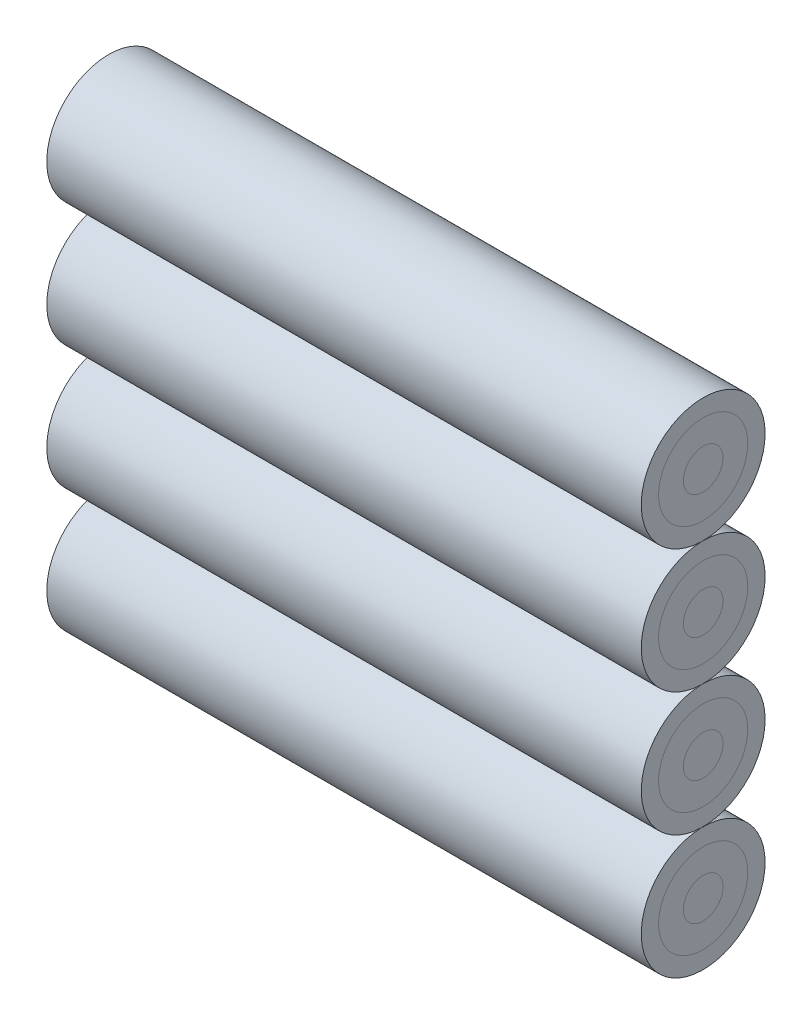
ISO-10303-21;
HEADER;
FILE_DESCRIPTION(('STEP AP214'),'2;1');
FILE_NAME('part.step','',(''),(''),'','','');
FILE_SCHEMA(('AUTOMOTIVE_DESIGN { 1 0 10303 214 1 1 1 1 }'));
ENDSEC;
DATA;
#1=APPLICATION_CONTEXT('core data for automotive mechanical design processes');
#2=APPLICATION_PROTOCOL_DEFINITION('international standard','automotive_design',2000,#1);
#3=PRODUCT_CONTEXT('',#1,'mechanical');
#4=PRODUCT('Part','Part','',(#3));
#5=PRODUCT_RELATED_PRODUCT_CATEGORY('part','',(#4));
#6=PRODUCT_DEFINITION_FORMATION('','',#4);
#7=PRODUCT_DEFINITION_CONTEXT('part definition',#1,'design');
#8=PRODUCT_DEFINITION('design','',#6,#7);
#9=PRODUCT_DEFINITION_SHAPE('','',#8);
#10=(LENGTH_UNIT() NAMED_UNIT(*) SI_UNIT(.MILLI.,.METRE.));
#11=(NAMED_UNIT(*) PLANE_ANGLE_UNIT() SI_UNIT($,.RADIAN.));
#12=(NAMED_UNIT(*) SI_UNIT($,.STERADIAN.) SOLID_ANGLE_UNIT());
#13=UNCERTAINTY_MEASURE_WITH_UNIT(LENGTH_MEASURE(1.E-05),#10,'distance_accuracy_value','');
#14=(GEOMETRIC_REPRESENTATION_CONTEXT(3) GLOBAL_UNCERTAINTY_ASSIGNED_CONTEXT((#13)) GLOBAL_UNIT_ASSIGNED_CONTEXT((#10,
#11,#12)) REPRESENTATION_CONTEXT('',''));
#15=CARTESIAN_POINT('',(0.,0.,0.));
#16=DIRECTION('',(0.,0.,1.));
#17=DIRECTION('',(1.,0.,0.));
#18=AXIS2_PLACEMENT_3D('',#15,#16,#17);
#19=CARTESIAN_POINT('',(1200.,-375.,0.));
#20=DIRECTION('',(-1.,0.,0.));
#21=DIRECTION('',(0.,0.,1.));
#22=AXIS2_PLACEMENT_3D('',#19,#20,#21);
#23=CYLINDRICAL_SURFACE('',#22,40.);
#24=CARTESIAN_POINT('',(1200.,-375.,0.));
#25=DIRECTION('',(1.,0.,0.));
#26=DIRECTION('',(0.,0.,-1.));
#27=AXIS2_PLACEMENT_3D('',#24,#25,#26);
#28=CIRCLE('',#27,40.);
#29=CARTESIAN_POINT('',(1200.,-375.,-40.));
#30=VERTEX_POINT('',#29);
#31=EDGE_CURVE('E12',#30,#30,#28,.T.);
#32=ORIENTED_EDGE('',*,*,#31,.F.);
#33=EDGE_LOOP('',(#32));
#34=FACE_BOUND('',#33,.T.);
#35=CARTESIAN_POINT('',(0.,-375.,0.));
#36=DIRECTION('',(1.,0.,0.));
#37=DIRECTION('',(0.,0.,-1.));
#38=AXIS2_PLACEMENT_3D('',#35,#36,#37);
#39=CIRCLE('',#38,40.);
#40=CARTESIAN_POINT('',(0.,-375.,-40.));
#41=VERTEX_POINT('',#40);
#42=EDGE_CURVE('E66',#41,#41,#39,.T.);
#43=ORIENTED_EDGE('',*,*,#42,.T.);
#44=EDGE_LOOP('',(#43));
#45=FACE_BOUND('',#44,.T.);
#46=ADVANCED_FACE('F63',(#34,#45),#23,.T.);
#47=CARTESIAN_POINT('',(1200.,-375.,0.));
#48=DIRECTION('',(1.,0.,0.));
#49=DIRECTION('',(0.,0.,-1.));
#50=AXIS2_PLACEMENT_3D('',#47,#48,#49);
#51=PLANE('',#50);
#52=ORIENTED_EDGE('',*,*,#31,.T.);
#53=EDGE_LOOP('',(#52));
#54=FACE_BOUND('',#53,.T.);
#55=ADVANCED_FACE('F78',(#54),#51,.T.);
#56=CARTESIAN_POINT('',(0.,-375.,0.));
#57=DIRECTION('',(1.,0.,0.));
#58=DIRECTION('',(0.,0.,-1.));
#59=AXIS2_PLACEMENT_3D('',#56,#57,#58);
#60=PLANE('',#59);
#61=ORIENTED_EDGE('',*,*,#42,.F.);
#62=EDGE_LOOP('',(#61));
#63=FACE_BOUND('',#62,.T.);
#64=ADVANCED_FACE('F76',(#63),#60,.F.);
#65=CLOSED_SHELL('',(#46,#55,#64));
#66=MANIFOLD_SOLID_BREP('B2',#65);
#67=CARTESIAN_POINT('',(1200.,-125.,0.));
#68=DIRECTION('',(-1.,0.,0.));
#69=DIRECTION('',(0.,0.,1.));
#70=AXIS2_PLACEMENT_3D('',#67,#68,#69);
#71=CYLINDRICAL_SURFACE('',#70,40.);
#72=CARTESIAN_POINT('',(1200.,-125.,0.));
#73=DIRECTION('',(1.,0.,0.));
#74=DIRECTION('',(0.,0.,-1.));
#75=AXIS2_PLACEMENT_3D('',#72,#73,#74);
#76=CIRCLE('',#75,40.);
#77=CARTESIAN_POINT('',(1200.,-125.,-40.));
#78=VERTEX_POINT('',#77);
#79=EDGE_CURVE('E62',#78,#78,#76,.T.);
#80=ORIENTED_EDGE('',*,*,#79,.F.);
#81=EDGE_LOOP('',(#80));
#82=FACE_BOUND('',#81,.T.);
#83=CARTESIAN_POINT('',(0.,-125.,0.));
#84=DIRECTION('',(1.,0.,0.));
#85=DIRECTION('',(0.,0.,-1.));
#86=AXIS2_PLACEMENT_3D('',#83,#84,#85);
#87=CIRCLE('',#86,40.);
#88=CARTESIAN_POINT('',(0.,-125.,-40.));
#89=VERTEX_POINT('',#88);
#90=EDGE_CURVE('E114',#89,#89,#87,.T.);
#91=ORIENTED_EDGE('',*,*,#90,.T.);
#92=EDGE_LOOP('',(#91));
#93=FACE_BOUND('',#92,.T.);
#94=ADVANCED_FACE('F111',(#82,#93),#71,.T.);
#95=CARTESIAN_POINT('',(1200.,-125.,0.));
#96=DIRECTION('',(1.,0.,0.));
#97=DIRECTION('',(0.,0.,-1.));
#98=AXIS2_PLACEMENT_3D('',#95,#96,#97);
#99=PLANE('',#98);
#100=ORIENTED_EDGE('',*,*,#79,.T.);
#101=EDGE_LOOP('',(#100));
#102=FACE_BOUND('',#101,.T.);
#103=ADVANCED_FACE('F126',(#102),#99,.T.);
#104=CARTESIAN_POINT('',(0.,-125.,0.));
#105=DIRECTION('',(1.,0.,0.));
#106=DIRECTION('',(0.,0.,-1.));
#107=AXIS2_PLACEMENT_3D('',#104,#105,#106);
#108=PLANE('',#107);
#109=ORIENTED_EDGE('',*,*,#90,.F.);
#110=EDGE_LOOP('',(#109));
#111=FACE_BOUND('',#110,.T.);
#112=ADVANCED_FACE('F124',(#111),#108,.F.);
#113=CLOSED_SHELL('',(#94,#103,#112));
#114=MANIFOLD_SOLID_BREP('B7',#113);
#115=CARTESIAN_POINT('',(1200.,125.,0.));
#116=DIRECTION('',(-1.,0.,0.));
#117=DIRECTION('',(0.,0.,1.));
#118=AXIS2_PLACEMENT_3D('',#115,#116,#117);
#119=CYLINDRICAL_SURFACE('',#118,40.);
#120=CARTESIAN_POINT('',(1200.,125.,0.));
#121=DIRECTION('',(1.,0.,0.));
#122=DIRECTION('',(0.,0.,-1.));
#123=AXIS2_PLACEMENT_3D('',#120,#121,#122);
#124=CIRCLE('',#123,40.);
#125=CARTESIAN_POINT('',(1200.,125.,-40.));
#126=VERTEX_POINT('',#125);
#127=EDGE_CURVE('E110',#126,#126,#124,.T.);
#128=ORIENTED_EDGE('',*,*,#127,.F.);
#129=EDGE_LOOP('',(#128));
#130=FACE_BOUND('',#129,.T.);
#131=CARTESIAN_POINT('',(0.,125.,0.));
#132=DIRECTION('',(1.,0.,0.));
#133=DIRECTION('',(0.,0.,-1.));
#134=AXIS2_PLACEMENT_3D('',#131,#132,#133);
#135=CIRCLE('',#134,40.);
#136=CARTESIAN_POINT('',(0.,125.,-40.));
#137=VERTEX_POINT('',#136);
#138=EDGE_CURVE('E162',#137,#137,#135,.T.);
#139=ORIENTED_EDGE('',*,*,#138,.T.);
#140=EDGE_LOOP('',(#139));
#141=FACE_BOUND('',#140,.T.);
#142=ADVANCED_FACE('F159',(#130,#141),#119,.T.);
#143=CARTESIAN_POINT('',(1200.,125.,0.));
#144=DIRECTION('',(1.,0.,0.));
#145=DIRECTION('',(0.,0.,-1.));
#146=AXIS2_PLACEMENT_3D('',#143,#144,#145);
#147=PLANE('',#146);
#148=ORIENTED_EDGE('',*,*,#127,.T.);
#149=EDGE_LOOP('',(#148));
#150=FACE_BOUND('',#149,.T.);
#151=ADVANCED_FACE('F174',(#150),#147,.T.);
#152=CARTESIAN_POINT('',(0.,125.,0.));
#153=DIRECTION('',(1.,0.,0.));
#154=DIRECTION('',(0.,0.,-1.));
#155=AXIS2_PLACEMENT_3D('',#152,#153,#154);
#156=PLANE('',#155);
#157=ORIENTED_EDGE('',*,*,#138,.F.);
#158=EDGE_LOOP('',(#157));
#159=FACE_BOUND('',#158,.T.);
#160=ADVANCED_FACE('F172',(#159),#156,.F.);
#161=CLOSED_SHELL('',(#142,#151,#160));
#162=MANIFOLD_SOLID_BREP('B57',#161);
#163=CARTESIAN_POINT('',(1200.,375.,0.));
#164=DIRECTION('',(-1.,0.,0.));
#165=DIRECTION('',(0.,0.,1.));
#166=AXIS2_PLACEMENT_3D('',#163,#164,#165);
#167=CYLINDRICAL_SURFACE('',#166,40.);
#168=CARTESIAN_POINT('',(1200.,375.,0.));
#169=DIRECTION('',(1.,0.,0.));
#170=DIRECTION('',(0.,0.,-1.));
#171=AXIS2_PLACEMENT_3D('',#168,#169,#170);
#172=CIRCLE('',#171,40.);
#173=CARTESIAN_POINT('',(1200.,375.,-40.));
#174=VERTEX_POINT('',#173);
#175=EDGE_CURVE('E158',#174,#174,#172,.T.);
#176=ORIENTED_EDGE('',*,*,#175,.F.);
#177=EDGE_LOOP('',(#176));
#178=FACE_BOUND('',#177,.T.);
#179=CARTESIAN_POINT('',(0.,375.,0.));
#180=DIRECTION('',(1.,0.,0.));
#181=DIRECTION('',(0.,0.,-1.));
#182=AXIS2_PLACEMENT_3D('',#179,#180,#181);
#183=CIRCLE('',#182,40.);
#184=CARTESIAN_POINT('',(0.,375.,-40.));
#185=VERTEX_POINT('',#184);
#186=EDGE_CURVE('E210',#185,#185,#183,.T.);
#187=ORIENTED_EDGE('',*,*,#186,.T.);
#188=EDGE_LOOP('',(#187));
#189=FACE_BOUND('',#188,.T.);
#190=ADVANCED_FACE('F207',(#178,#189),#167,.T.);
#191=CARTESIAN_POINT('',(1200.,375.,0.));
#192=DIRECTION('',(1.,0.,0.));
#193=DIRECTION('',(0.,0.,-1.));
#194=AXIS2_PLACEMENT_3D('',#191,#192,#193);
#195=PLANE('',#194);
#196=ORIENTED_EDGE('',*,*,#175,.T.);
#197=EDGE_LOOP('',(#196));
#198=FACE_BOUND('',#197,.T.);
#199=ADVANCED_FACE('F222',(#198),#195,.T.);
#200=CARTESIAN_POINT('',(0.,375.,0.));
#201=DIRECTION('',(1.,0.,0.));
#202=DIRECTION('',(0.,0.,-1.));
#203=AXIS2_PLACEMENT_3D('',#200,#201,#202);
#204=PLANE('',#203);
#205=ORIENTED_EDGE('',*,*,#186,.F.);
#206=EDGE_LOOP('',(#205));
#207=FACE_BOUND('',#206,.T.);
#208=ADVANCED_FACE('F220',(#207),#204,.F.);
#209=CLOSED_SHELL('',(#190,#199,#208));
#210=MANIFOLD_SOLID_BREP('B105',#209);
#211=CARTESIAN_POINT('',(1200.,-375.,0.));
#212=DIRECTION('',(-1.,0.,0.));
#213=DIRECTION('',(0.,0.,1.));
#214=AXIS2_PLACEMENT_3D('',#211,#212,#213);
#215=CYLINDRICAL_SURFACE('',#214,90.);
#216=CARTESIAN_POINT('',(1200.,-375.,0.));
#217=DIRECTION('',(1.,0.,0.));
#218=DIRECTION('',(0.,0.,-1.));
#219=AXIS2_PLACEMENT_3D('',#216,#217,#218);
#220=CIRCLE('',#219,90.);
#221=CARTESIAN_POINT('',(1200.,-375.,-90.));
#222=VERTEX_POINT('',#221);
#223=EDGE_CURVE('E206',#222,#222,#220,.T.);
#224=ORIENTED_EDGE('',*,*,#223,.F.);
#225=EDGE_LOOP('',(#224));
#226=FACE_BOUND('',#225,.T.);
#227=CARTESIAN_POINT('',(0.,-375.,0.));
#228=DIRECTION('',(1.,0.,0.));
#229=DIRECTION('',(0.,0.,-1.));
#230=AXIS2_PLACEMENT_3D('',#227,#228,#229);
#231=CIRCLE('',#230,90.);
#232=CARTESIAN_POINT('',(0.,-375.,-90.));
#233=VERTEX_POINT('',#232);
#234=EDGE_CURVE('E258',#233,#233,#231,.T.);
#235=ORIENTED_EDGE('',*,*,#234,.T.);
#236=EDGE_LOOP('',(#235));
#237=FACE_BOUND('',#236,.T.);
#238=ADVANCED_FACE('F255',(#226,#237),#215,.T.);
#239=CARTESIAN_POINT('',(1200.,-375.,0.));
#240=DIRECTION('',(1.,0.,0.));
#241=DIRECTION('',(0.,0.,-1.));
#242=AXIS2_PLACEMENT_3D('',#239,#240,#241);
#243=PLANE('',#242);
#244=CARTESIAN_POINT('',(1200.,-375.,0.));
#245=DIRECTION('',(1.,0.,0.));
#246=DIRECTION('',(0.,0.,-1.));
#247=AXIS2_PLACEMENT_3D('',#244,#245,#246);
#248=CIRCLE('',#247,40.);
#249=CARTESIAN_POINT('',(1200.,-375.,-40.));
#250=VERTEX_POINT('',#249);
#251=EDGE_CURVE('E267',#250,#250,#248,.T.);
#252=ORIENTED_EDGE('',*,*,#251,.F.);
#253=EDGE_LOOP('',(#252));
#254=FACE_BOUND('',#253,.T.);
#255=ORIENTED_EDGE('',*,*,#223,.T.);
#256=EDGE_LOOP('',(#255));
#257=FACE_BOUND('',#256,.T.);
#258=ADVANCED_FACE('F282',(#254,#257),#243,.T.);
#259=CARTESIAN_POINT('',(0.,-375.,0.));
#260=DIRECTION('',(1.,0.,0.));
#261=DIRECTION('',(0.,0.,-1.));
#262=AXIS2_PLACEMENT_3D('',#259,#260,#261);
#263=PLANE('',#262);
#264=CARTESIAN_POINT('',(0.,-375.,0.));
#265=DIRECTION('',(1.,0.,0.));
#266=DIRECTION('',(0.,0.,-1.));
#267=AXIS2_PLACEMENT_3D('',#264,#265,#266);
#268=CIRCLE('',#267,40.);
#269=CARTESIAN_POINT('',(0.,-375.,-40.));
#270=VERTEX_POINT('',#269);
#271=EDGE_CURVE('E265',#270,#270,#268,.T.);
#272=ORIENTED_EDGE('',*,*,#271,.T.);
#273=EDGE_LOOP('',(#272));
#274=FACE_BOUND('',#273,.T.);
#275=ORIENTED_EDGE('',*,*,#234,.F.);
#276=EDGE_LOOP('',(#275));
#277=FACE_BOUND('',#276,.T.);
#278=ADVANCED_FACE('F273',(#274,#277),#263,.F.);
#279=CARTESIAN_POINT('',(0.,-375.,0.));
#280=DIRECTION('',(1.,0.,0.));
#281=DIRECTION('',(0.,0.,-1.));
#282=AXIS2_PLACEMENT_3D('',#279,#280,#281);
#283=CYLINDRICAL_SURFACE('',#282,40.);
#284=ORIENTED_EDGE('',*,*,#271,.F.);
#285=EDGE_LOOP('',(#284));
#286=FACE_BOUND('',#285,.T.);
#287=ORIENTED_EDGE('',*,*,#251,.T.);
#288=EDGE_LOOP('',(#287));
#289=FACE_BOUND('',#288,.T.);
#290=ADVANCED_FACE('F276',(#286,#289),#283,.F.);
#291=CLOSED_SHELL('',(#238,#258,#278,#290));
#292=MANIFOLD_SOLID_BREP('B153',#291);
#293=CARTESIAN_POINT('',(1200.,-125.,0.));
#294=DIRECTION('',(-1.,0.,0.));
#295=DIRECTION('',(0.,0.,1.));
#296=AXIS2_PLACEMENT_3D('',#293,#294,#295);
#297=CYLINDRICAL_SURFACE('',#296,90.);
#298=CARTESIAN_POINT('',(1200.,-125.,0.));
#299=DIRECTION('',(1.,0.,0.));
#300=DIRECTION('',(0.,0.,-1.));
#301=AXIS2_PLACEMENT_3D('',#298,#299,#300);
#302=CIRCLE('',#301,90.);
#303=CARTESIAN_POINT('',(1200.,-125.,-90.));
#304=VERTEX_POINT('',#303);
#305=EDGE_CURVE('E254',#304,#304,#302,.T.);
#306=ORIENTED_EDGE('',*,*,#305,.F.);
#307=EDGE_LOOP('',(#306));
#308=FACE_BOUND('',#307,.T.);
#309=CARTESIAN_POINT('',(0.,-125.,0.));
#310=DIRECTION('',(1.,0.,0.));
#311=DIRECTION('',(0.,0.,-1.));
#312=AXIS2_PLACEMENT_3D('',#309,#310,#311);
#313=CIRCLE('',#312,90.);
#314=CARTESIAN_POINT('',(0.,-125.,-90.));
#315=VERTEX_POINT('',#314);
#316=EDGE_CURVE('E327',#315,#315,#313,.T.);
#317=ORIENTED_EDGE('',*,*,#316,.T.);
#318=EDGE_LOOP('',(#317));
#319=FACE_BOUND('',#318,.T.);
#320=ADVANCED_FACE('F324',(#308,#319),#297,.T.);
#321=CARTESIAN_POINT('',(1200.,-125.,0.));
#322=DIRECTION('',(1.,0.,0.));
#323=DIRECTION('',(0.,0.,-1.));
#324=AXIS2_PLACEMENT_3D('',#321,#322,#323);
#325=PLANE('',#324);
#326=CARTESIAN_POINT('',(1200.,-125.,0.));
#327=DIRECTION('',(1.,0.,0.));
#328=DIRECTION('',(0.,0.,-1.));
#329=AXIS2_PLACEMENT_3D('',#326,#327,#328);
#330=CIRCLE('',#329,40.);
#331=CARTESIAN_POINT('',(1200.,-125.,-40.));
#332=VERTEX_POINT('',#331);
#333=EDGE_CURVE('E336',#332,#332,#330,.T.);
#334=ORIENTED_EDGE('',*,*,#333,.F.);
#335=EDGE_LOOP('',(#334));
#336=FACE_BOUND('',#335,.T.);
#337=ORIENTED_EDGE('',*,*,#305,.T.);
#338=EDGE_LOOP('',(#337));
#339=FACE_BOUND('',#338,.T.);
#340=ADVANCED_FACE('F351',(#336,#339),#325,.T.);
#341=CARTESIAN_POINT('',(0.,-125.,0.));
#342=DIRECTION('',(1.,0.,0.));
#343=DIRECTION('',(0.,0.,-1.));
#344=AXIS2_PLACEMENT_3D('',#341,#342,#343);
#345=PLANE('',#344);
#346=CARTESIAN_POINT('',(0.,-125.,0.));
#347=DIRECTION('',(1.,0.,0.));
#348=DIRECTION('',(0.,0.,-1.));
#349=AXIS2_PLACEMENT_3D('',#346,#347,#348);
#350=CIRCLE('',#349,40.);
#351=CARTESIAN_POINT('',(0.,-125.,-40.));
#352=VERTEX_POINT('',#351);
#353=EDGE_CURVE('E334',#352,#352,#350,.T.);
#354=ORIENTED_EDGE('',*,*,#353,.T.);
#355=EDGE_LOOP('',(#354));
#356=FACE_BOUND('',#355,.T.);
#357=ORIENTED_EDGE('',*,*,#316,.F.);
#358=EDGE_LOOP('',(#357));
#359=FACE_BOUND('',#358,.T.);
#360=ADVANCED_FACE('F342',(#356,#359),#345,.F.);
#361=CARTESIAN_POINT('',(0.,-125.,0.));
#362=DIRECTION('',(1.,0.,0.));
#363=DIRECTION('',(0.,0.,-1.));
#364=AXIS2_PLACEMENT_3D('',#361,#362,#363);
#365=CYLINDRICAL_SURFACE('',#364,40.);
#366=ORIENTED_EDGE('',*,*,#353,.F.);
#367=EDGE_LOOP('',(#366));
#368=FACE_BOUND('',#367,.T.);
#369=ORIENTED_EDGE('',*,*,#333,.T.);
#370=EDGE_LOOP('',(#369));
#371=FACE_BOUND('',#370,.T.);
#372=ADVANCED_FACE('F345',(#368,#371),#365,.F.);
#373=CLOSED_SHELL('',(#320,#340,#360,#372));
#374=MANIFOLD_SOLID_BREP('B201',#373);
#375=CARTESIAN_POINT('',(1200.,125.,0.));
#376=DIRECTION('',(-1.,0.,0.));
#377=DIRECTION('',(0.,0.,1.));
#378=AXIS2_PLACEMENT_3D('',#375,#376,#377);
#379=CYLINDRICAL_SURFACE('',#378,90.);
#380=CARTESIAN_POINT('',(1200.,125.,0.));
#381=DIRECTION('',(1.,0.,0.));
#382=DIRECTION('',(0.,0.,-1.));
#383=AXIS2_PLACEMENT_3D('',#380,#381,#382);
#384=CIRCLE('',#383,90.);
#385=CARTESIAN_POINT('',(1200.,125.,-90.));
#386=VERTEX_POINT('',#385);
#387=EDGE_CURVE('E323',#386,#386,#384,.T.);
#388=ORIENTED_EDGE('',*,*,#387,.F.);
#389=EDGE_LOOP('',(#388));
#390=FACE_BOUND('',#389,.T.);
#391=CARTESIAN_POINT('',(0.,125.,0.));
#392=DIRECTION('',(1.,0.,0.));
#393=DIRECTION('',(0.,0.,-1.));
#394=AXIS2_PLACEMENT_3D('',#391,#392,#393);
#395=CIRCLE('',#394,90.);
#396=CARTESIAN_POINT('',(0.,125.,-90.));
#397=VERTEX_POINT('',#396);
#398=EDGE_CURVE('E396',#397,#397,#395,.T.);
#399=ORIENTED_EDGE('',*,*,#398,.T.);
#400=EDGE_LOOP('',(#399));
#401=FACE_BOUND('',#400,.T.);
#402=ADVANCED_FACE('F393',(#390,#401),#379,.T.);
#403=CARTESIAN_POINT('',(1200.,125.,0.));
#404=DIRECTION('',(1.,0.,0.));
#405=DIRECTION('',(0.,0.,-1.));
#406=AXIS2_PLACEMENT_3D('',#403,#404,#405);
#407=PLANE('',#406);
#408=CARTESIAN_POINT('',(1200.,125.,0.));
#409=DIRECTION('',(1.,0.,0.));
#410=DIRECTION('',(0.,0.,-1.));
#411=AXIS2_PLACEMENT_3D('',#408,#409,#410);
#412=CIRCLE('',#411,40.);
#413=CARTESIAN_POINT('',(1200.,125.,-40.));
#414=VERTEX_POINT('',#413);
#415=EDGE_CURVE('E405',#414,#414,#412,.T.);
#416=ORIENTED_EDGE('',*,*,#415,.F.);
#417=EDGE_LOOP('',(#416));
#418=FACE_BOUND('',#417,.T.);
#419=ORIENTED_EDGE('',*,*,#387,.T.);
#420=EDGE_LOOP('',(#419));
#421=FACE_BOUND('',#420,.T.);
#422=ADVANCED_FACE('F420',(#418,#421),#407,.T.);
#423=CARTESIAN_POINT('',(0.,125.,0.));
#424=DIRECTION('',(1.,0.,0.));
#425=DIRECTION('',(0.,0.,-1.));
#426=AXIS2_PLACEMENT_3D('',#423,#424,#425);
#427=PLANE('',#426);
#428=CARTESIAN_POINT('',(0.,125.,0.));
#429=DIRECTION('',(1.,0.,0.));
#430=DIRECTION('',(0.,0.,-1.));
#431=AXIS2_PLACEMENT_3D('',#428,#429,#430);
#432=CIRCLE('',#431,40.);
#433=CARTESIAN_POINT('',(0.,125.,-40.));
#434=VERTEX_POINT('',#433);
#435=EDGE_CURVE('E403',#434,#434,#432,.T.);
#436=ORIENTED_EDGE('',*,*,#435,.T.);
#437=EDGE_LOOP('',(#436));
#438=FACE_BOUND('',#437,.T.);
#439=ORIENTED_EDGE('',*,*,#398,.F.);
#440=EDGE_LOOP('',(#439));
#441=FACE_BOUND('',#440,.T.);
#442=ADVANCED_FACE('F411',(#438,#441),#427,.F.);
#443=CARTESIAN_POINT('',(0.,125.,0.));
#444=DIRECTION('',(1.,0.,0.));
#445=DIRECTION('',(0.,0.,-1.));
#446=AXIS2_PLACEMENT_3D('',#443,#444,#445);
#447=CYLINDRICAL_SURFACE('',#446,40.);
#448=ORIENTED_EDGE('',*,*,#435,.F.);
#449=EDGE_LOOP('',(#448));
#450=FACE_BOUND('',#449,.T.);
#451=ORIENTED_EDGE('',*,*,#415,.T.);
#452=EDGE_LOOP('',(#451));
#453=FACE_BOUND('',#452,.T.);
#454=ADVANCED_FACE('F414',(#450,#453),#447,.F.);
#455=CLOSED_SHELL('',(#402,#422,#442,#454));
#456=MANIFOLD_SOLID_BREP('B249',#455);
#457=CARTESIAN_POINT('',(1200.,375.,0.));
#458=DIRECTION('',(-1.,0.,0.));
#459=DIRECTION('',(0.,0.,1.));
#460=AXIS2_PLACEMENT_3D('',#457,#458,#459);
#461=CYLINDRICAL_SURFACE('',#460,90.);
#462=CARTESIAN_POINT('',(1200.,375.,0.));
#463=DIRECTION('',(1.,0.,0.));
#464=DIRECTION('',(0.,0.,-1.));
#465=AXIS2_PLACEMENT_3D('',#462,#463,#464);
#466=CIRCLE('',#465,90.);
#467=CARTESIAN_POINT('',(1200.,375.,-90.));
#468=VERTEX_POINT('',#467);
#469=EDGE_CURVE('E392',#468,#468,#466,.T.);
#470=ORIENTED_EDGE('',*,*,#469,.F.);
#471=EDGE_LOOP('',(#470));
#472=FACE_BOUND('',#471,.T.);
#473=CARTESIAN_POINT('',(0.,375.,0.));
#474=DIRECTION('',(1.,0.,0.));
#475=DIRECTION('',(0.,0.,-1.));
#476=AXIS2_PLACEMENT_3D('',#473,#474,#475);
#477=CIRCLE('',#476,90.);
#478=CARTESIAN_POINT('',(0.,375.,-90.));
#479=VERTEX_POINT('',#478);
#480=EDGE_CURVE('E465',#479,#479,#477,.T.);
#481=ORIENTED_EDGE('',*,*,#480,.T.);
#482=EDGE_LOOP('',(#481));
#483=FACE_BOUND('',#482,.T.);
#484=ADVANCED_FACE('F462',(#472,#483),#461,.T.);
#485=CARTESIAN_POINT('',(1200.,375.,0.));
#486=DIRECTION('',(1.,0.,0.));
#487=DIRECTION('',(0.,0.,-1.));
#488=AXIS2_PLACEMENT_3D('',#485,#486,#487);
#489=PLANE('',#488);
#490=CARTESIAN_POINT('',(1200.,375.,0.));
#491=DIRECTION('',(1.,0.,0.));
#492=DIRECTION('',(0.,0.,-1.));
#493=AXIS2_PLACEMENT_3D('',#490,#491,#492);
#494=CIRCLE('',#493,40.);
#495=CARTESIAN_POINT('',(1200.,375.,-40.));
#496=VERTEX_POINT('',#495);
#497=EDGE_CURVE('E474',#496,#496,#494,.T.);
#498=ORIENTED_EDGE('',*,*,#497,.F.);
#499=EDGE_LOOP('',(#498));
#500=FACE_BOUND('',#499,.T.);
#501=ORIENTED_EDGE('',*,*,#469,.T.);
#502=EDGE_LOOP('',(#501));
#503=FACE_BOUND('',#502,.T.);
#504=ADVANCED_FACE('F489',(#500,#503),#489,.T.);
#505=CARTESIAN_POINT('',(0.,375.,0.));
#506=DIRECTION('',(1.,0.,0.));
#507=DIRECTION('',(0.,0.,-1.));
#508=AXIS2_PLACEMENT_3D('',#505,#506,#507);
#509=PLANE('',#508);
#510=CARTESIAN_POINT('',(0.,375.,0.));
#511=DIRECTION('',(1.,0.,0.));
#512=DIRECTION('',(0.,0.,-1.));
#513=AXIS2_PLACEMENT_3D('',#510,#511,#512);
#514=CIRCLE('',#513,40.);
#515=CARTESIAN_POINT('',(0.,375.,-40.));
#516=VERTEX_POINT('',#515);
#517=EDGE_CURVE('E472',#516,#516,#514,.T.);
#518=ORIENTED_EDGE('',*,*,#517,.T.);
#519=EDGE_LOOP('',(#518));
#520=FACE_BOUND('',#519,.T.);
#521=ORIENTED_EDGE('',*,*,#480,.F.);
#522=EDGE_LOOP('',(#521));
#523=FACE_BOUND('',#522,.T.);
#524=ADVANCED_FACE('F480',(#520,#523),#509,.F.);
#525=CARTESIAN_POINT('',(0.,375.,0.));
#526=DIRECTION('',(1.,0.,0.));
#527=DIRECTION('',(0.,0.,-1.));
#528=AXIS2_PLACEMENT_3D('',#525,#526,#527);
#529=CYLINDRICAL_SURFACE('',#528,40.);
#530=ORIENTED_EDGE('',*,*,#517,.F.);
#531=EDGE_LOOP('',(#530));
#532=FACE_BOUND('',#531,.T.);
#533=ORIENTED_EDGE('',*,*,#497,.T.);
#534=EDGE_LOOP('',(#533));
#535=FACE_BOUND('',#534,.T.);
#536=ADVANCED_FACE('F483',(#532,#535),#529,.F.);
#537=CLOSED_SHELL('',(#484,#504,#524,#536));
#538=MANIFOLD_SOLID_BREP('B318',#537);
#539=CARTESIAN_POINT('',(1200.,-375.,0.));
#540=DIRECTION('',(-1.,0.,0.));
#541=DIRECTION('',(0.,0.,1.));
#542=AXIS2_PLACEMENT_3D('',#539,#540,#541);
#543=CYLINDRICAL_SURFACE('',#542,125.);
#544=CARTESIAN_POINT('',(0.,-375.,0.));
#545=DIRECTION('',(1.,0.,0.));
#546=DIRECTION('',(0.,0.,-1.));
#547=AXIS2_PLACEMENT_3D('',#544,#545,#546);
#548=CIRCLE('',#547,125.);
#549=CARTESIAN_POINT('',(0.,-375.,-125.));
#550=VERTEX_POINT('',#549);
#551=EDGE_CURVE('E461',#550,#550,#548,.T.);
#552=ORIENTED_EDGE('',*,*,#551,.T.);
#553=EDGE_LOOP('',(#552));
#554=FACE_BOUND('',#553,.T.);
#555=CARTESIAN_POINT('',(1200.,-375.,0.));
#556=DIRECTION('',(1.,0.,0.));
#557=DIRECTION('',(0.,0.,-1.));
#558=AXIS2_PLACEMENT_3D('',#555,#556,#557);
#559=CIRCLE('',#558,125.);
#560=CARTESIAN_POINT('',(1200.,-375.,-125.));
#561=VERTEX_POINT('',#560);
#562=EDGE_CURVE('E535',#561,#561,#559,.T.);
#563=ORIENTED_EDGE('',*,*,#562,.F.);
#564=EDGE_LOOP('',(#563));
#565=FACE_BOUND('',#564,.T.);
#566=ADVANCED_FACE('F531',(#554,#565),#543,.T.);
#567=CARTESIAN_POINT('',(1200.,0.,0.));
#568=DIRECTION('',(1.,0.,0.));
#569=DIRECTION('',(0.,0.,-1.));
#570=AXIS2_PLACEMENT_3D('',#567,#568,#569);
#571=PLANE('',#570);
#572=CARTESIAN_POINT('',(1200.,-375.,0.));
#573=DIRECTION('',(1.,0.,0.));
#574=DIRECTION('',(0.,0.,-1.));
#575=AXIS2_PLACEMENT_3D('',#572,#573,#574);
#576=CIRCLE('',#575,90.);
#577=CARTESIAN_POINT('',(1200.,-375.,-90.));
#578=VERTEX_POINT('',#577);
#579=EDGE_CURVE('E544',#578,#578,#576,.T.);
#580=ORIENTED_EDGE('',*,*,#579,.F.);
#581=EDGE_LOOP('',(#580));
#582=FACE_BOUND('',#581,.T.);
#583=ORIENTED_EDGE('',*,*,#562,.T.);
#584=EDGE_LOOP('',(#583));
#585=FACE_BOUND('',#584,.T.);
#586=ADVANCED_FACE('F533',(#582,#585),#571,.T.);
#587=CARTESIAN_POINT('',(0.,0.,0.));
#588=DIRECTION('',(1.,0.,0.));
#589=DIRECTION('',(0.,0.,-1.));
#590=AXIS2_PLACEMENT_3D('',#587,#588,#589);
#591=PLANE('',#590);
#592=CARTESIAN_POINT('',(0.,-375.,0.));
#593=DIRECTION('',(1.,0.,0.));
#594=DIRECTION('',(0.,0.,-1.));
#595=AXIS2_PLACEMENT_3D('',#592,#593,#594);
#596=CIRCLE('',#595,90.);
#597=CARTESIAN_POINT('',(0.,-375.,-90.));
#598=VERTEX_POINT('',#597);
#599=EDGE_CURVE('E542',#598,#598,#596,.T.);
#600=ORIENTED_EDGE('',*,*,#599,.T.);
#601=EDGE_LOOP('',(#600));
#602=FACE_BOUND('',#601,.T.);
#603=ORIENTED_EDGE('',*,*,#551,.F.);
#604=EDGE_LOOP('',(#603));
#605=FACE_BOUND('',#604,.T.);
#606=ADVANCED_FACE('F550',(#602,#605),#591,.F.);
#607=CARTESIAN_POINT('',(0.,-375.,0.));
#608=DIRECTION('',(1.,0.,0.));
#609=DIRECTION('',(0.,0.,-1.));
#610=AXIS2_PLACEMENT_3D('',#607,#608,#609);
#611=CYLINDRICAL_SURFACE('',#610,90.);
#612=ORIENTED_EDGE('',*,*,#599,.F.);
#613=EDGE_LOOP('',(#612));
#614=FACE_BOUND('',#613,.T.);
#615=ORIENTED_EDGE('',*,*,#579,.T.);
#616=EDGE_LOOP('',(#615));
#617=FACE_BOUND('',#616,.T.);
#618=ADVANCED_FACE('F553',(#614,#617),#611,.F.);
#619=CLOSED_SHELL('',(#566,#586,#606,#618));
#620=MANIFOLD_SOLID_BREP('B387',#619);
#621=CARTESIAN_POINT('',(1200.,-125.,0.));
#622=DIRECTION('',(-1.,0.,0.));
#623=DIRECTION('',(0.,0.,1.));
#624=AXIS2_PLACEMENT_3D('',#621,#622,#623);
#625=CYLINDRICAL_SURFACE('',#624,125.);
#626=CARTESIAN_POINT('',(0.,-125.,0.));
#627=DIRECTION('',(1.,0.,0.));
#628=DIRECTION('',(0.,0.,-1.));
#629=AXIS2_PLACEMENT_3D('',#626,#627,#628);
#630=CIRCLE('',#629,125.);
#631=CARTESIAN_POINT('',(0.,-125.,-125.));
#632=VERTEX_POINT('',#631);
#633=EDGE_CURVE('E530',#632,#632,#630,.T.);
#634=ORIENTED_EDGE('',*,*,#633,.T.);
#635=EDGE_LOOP('',(#634));
#636=FACE_BOUND('',#635,.T.);
#637=CARTESIAN_POINT('',(1200.,-125.,0.));
#638=DIRECTION('',(1.,0.,0.));
#639=DIRECTION('',(0.,0.,-1.));
#640=AXIS2_PLACEMENT_3D('',#637,#638,#639);
#641=CIRCLE('',#640,125.);
#642=CARTESIAN_POINT('',(1200.,-125.,-125.));
#643=VERTEX_POINT('',#642);
#644=EDGE_CURVE('E604',#643,#643,#641,.T.);
#645=ORIENTED_EDGE('',*,*,#644,.F.);
#646=EDGE_LOOP('',(#645));
#647=FACE_BOUND('',#646,.T.);
#648=ADVANCED_FACE('F600',(#636,#647),#625,.T.);
#649=CARTESIAN_POINT('',(1200.,-125.,0.));
#650=DIRECTION('',(1.,0.,0.));
#651=DIRECTION('',(0.,0.,-1.));
#652=AXIS2_PLACEMENT_3D('',#649,#650,#651);
#653=PLANE('',#652);
#654=CARTESIAN_POINT('',(1200.,-125.,0.));
#655=DIRECTION('',(1.,0.,0.));
#656=DIRECTION('',(0.,0.,-1.));
#657=AXIS2_PLACEMENT_3D('',#654,#655,#656);
#658=CIRCLE('',#657,90.);
#659=CARTESIAN_POINT('',(1200.,-125.,-90.));
#660=VERTEX_POINT('',#659);
#661=EDGE_CURVE('E613',#660,#660,#658,.T.);
#662=ORIENTED_EDGE('',*,*,#661,.F.);
#663=EDGE_LOOP('',(#662));
#664=FACE_BOUND('',#663,.T.);
#665=ORIENTED_EDGE('',*,*,#644,.T.);
#666=EDGE_LOOP('',(#665));
#667=FACE_BOUND('',#666,.T.);
#668=ADVANCED_FACE('F602',(#664,#667),#653,.T.);
#669=CARTESIAN_POINT('',(0.,-125.,0.));
#670=DIRECTION('',(1.,0.,0.));
#671=DIRECTION('',(0.,0.,-1.));
#672=AXIS2_PLACEMENT_3D('',#669,#670,#671);
#673=PLANE('',#672);
#674=CARTESIAN_POINT('',(0.,-125.,0.));
#675=DIRECTION('',(1.,0.,0.));
#676=DIRECTION('',(0.,0.,-1.));
#677=AXIS2_PLACEMENT_3D('',#674,#675,#676);
#678=CIRCLE('',#677,90.);
#679=CARTESIAN_POINT('',(0.,-125.,-90.));
#680=VERTEX_POINT('',#679);
#681=EDGE_CURVE('E611',#680,#680,#678,.T.);
#682=ORIENTED_EDGE('',*,*,#681,.T.);
#683=EDGE_LOOP('',(#682));
#684=FACE_BOUND('',#683,.T.);
#685=ORIENTED_EDGE('',*,*,#633,.F.);
#686=EDGE_LOOP('',(#685));
#687=FACE_BOUND('',#686,.T.);
#688=ADVANCED_FACE('F619',(#684,#687),#673,.F.);
#689=CARTESIAN_POINT('',(0.,-125.,0.));
#690=DIRECTION('',(1.,0.,0.));
#691=DIRECTION('',(0.,0.,-1.));
#692=AXIS2_PLACEMENT_3D('',#689,#690,#691);
#693=CYLINDRICAL_SURFACE('',#692,90.);
#694=ORIENTED_EDGE('',*,*,#681,.F.);
#695=EDGE_LOOP('',(#694));
#696=FACE_BOUND('',#695,.T.);
#697=ORIENTED_EDGE('',*,*,#661,.T.);
#698=EDGE_LOOP('',(#697));
#699=FACE_BOUND('',#698,.T.);
#700=ADVANCED_FACE('F622',(#696,#699),#693,.F.);
#701=CLOSED_SHELL('',(#648,#668,#688,#700));
#702=MANIFOLD_SOLID_BREP('B456',#701);
#703=CARTESIAN_POINT('',(1200.,125.,0.));
#704=DIRECTION('',(-1.,0.,0.));
#705=DIRECTION('',(0.,0.,1.));
#706=AXIS2_PLACEMENT_3D('',#703,#704,#705);
#707=CYLINDRICAL_SURFACE('',#706,125.);
#708=CARTESIAN_POINT('',(0.,125.,0.));
#709=DIRECTION('',(1.,0.,0.));
#710=DIRECTION('',(0.,0.,-1.));
#711=AXIS2_PLACEMENT_3D('',#708,#709,#710);
#712=CIRCLE('',#711,125.);
#713=CARTESIAN_POINT('',(0.,125.,-125.));
#714=VERTEX_POINT('',#713);
#715=EDGE_CURVE('E599',#714,#714,#712,.T.);
#716=ORIENTED_EDGE('',*,*,#715,.T.);
#717=EDGE_LOOP('',(#716));
#718=FACE_BOUND('',#717,.T.);
#719=CARTESIAN_POINT('',(1200.,125.,0.));
#720=DIRECTION('',(1.,0.,0.));
#721=DIRECTION('',(0.,0.,-1.));
#722=AXIS2_PLACEMENT_3D('',#719,#720,#721);
#723=CIRCLE('',#722,125.);
#724=CARTESIAN_POINT('',(1200.,125.,-125.));
#725=VERTEX_POINT('',#724);
#726=EDGE_CURVE('E672',#725,#725,#723,.T.);
#727=ORIENTED_EDGE('',*,*,#726,.F.);
#728=EDGE_LOOP('',(#727));
#729=FACE_BOUND('',#728,.T.);
#730=ADVANCED_FACE('F668',(#718,#729),#707,.T.);
#731=CARTESIAN_POINT('',(1200.,125.,0.));
#732=DIRECTION('',(1.,0.,0.));
#733=DIRECTION('',(0.,0.,-1.));
#734=AXIS2_PLACEMENT_3D('',#731,#732,#733);
#735=PLANE('',#734);
#736=CARTESIAN_POINT('',(1200.,125.,0.));
#737=DIRECTION('',(1.,0.,0.));
#738=DIRECTION('',(0.,0.,-1.));
#739=AXIS2_PLACEMENT_3D('',#736,#737,#738);
#740=CIRCLE('',#739,90.);
#741=CARTESIAN_POINT('',(1200.,125.,-90.));
#742=VERTEX_POINT('',#741);
#743=EDGE_CURVE('E681',#742,#742,#740,.T.);
#744=ORIENTED_EDGE('',*,*,#743,.F.);
#745=EDGE_LOOP('',(#744));
#746=FACE_BOUND('',#745,.T.);
#747=ORIENTED_EDGE('',*,*,#726,.T.);
#748=EDGE_LOOP('',(#747));
#749=FACE_BOUND('',#748,.T.);
#750=ADVANCED_FACE('F670',(#746,#749),#735,.T.);
#751=CARTESIAN_POINT('',(0.,125.,0.));
#752=DIRECTION('',(1.,0.,0.));
#753=DIRECTION('',(0.,0.,-1.));
#754=AXIS2_PLACEMENT_3D('',#751,#752,#753);
#755=PLANE('',#754);
#756=CARTESIAN_POINT('',(0.,125.,0.));
#757=DIRECTION('',(1.,0.,0.));
#758=DIRECTION('',(0.,0.,-1.));
#759=AXIS2_PLACEMENT_3D('',#756,#757,#758);
#760=CIRCLE('',#759,90.);
#761=CARTESIAN_POINT('',(0.,125.,-90.));
#762=VERTEX_POINT('',#761);
#763=EDGE_CURVE('E679',#762,#762,#760,.T.);
#764=ORIENTED_EDGE('',*,*,#763,.T.);
#765=EDGE_LOOP('',(#764));
#766=FACE_BOUND('',#765,.T.);
#767=ORIENTED_EDGE('',*,*,#715,.F.);
#768=EDGE_LOOP('',(#767));
#769=FACE_BOUND('',#768,.T.);
#770=ADVANCED_FACE('F687',(#766,#769),#755,.F.);
#771=CARTESIAN_POINT('',(0.,125.,0.));
#772=DIRECTION('',(1.,0.,0.));
#773=DIRECTION('',(0.,0.,-1.));
#774=AXIS2_PLACEMENT_3D('',#771,#772,#773);
#775=CYLINDRICAL_SURFACE('',#774,90.);
#776=ORIENTED_EDGE('',*,*,#763,.F.);
#777=EDGE_LOOP('',(#776));
#778=FACE_BOUND('',#777,.T.);
#779=ORIENTED_EDGE('',*,*,#743,.T.);
#780=EDGE_LOOP('',(#779));
#781=FACE_BOUND('',#780,.T.);
#782=ADVANCED_FACE('F690',(#778,#781),#775,.F.);
#783=CLOSED_SHELL('',(#730,#750,#770,#782));
#784=MANIFOLD_SOLID_BREP('B525',#783);
#785=CARTESIAN_POINT('',(1200.,375.,0.));
#786=DIRECTION('',(-1.,0.,0.));
#787=DIRECTION('',(0.,0.,1.));
#788=AXIS2_PLACEMENT_3D('',#785,#786,#787);
#789=CYLINDRICAL_SURFACE('',#788,125.);
#790=CARTESIAN_POINT('',(0.,375.,0.));
#791=DIRECTION('',(1.,0.,0.));
#792=DIRECTION('',(0.,0.,-1.));
#793=AXIS2_PLACEMENT_3D('',#790,#791,#792);
#794=CIRCLE('',#793,125.);
#795=CARTESIAN_POINT('',(0.,375.,-125.));
#796=VERTEX_POINT('',#795);
#797=EDGE_CURVE('E732',#796,#796,#794,.T.);
#798=ORIENTED_EDGE('',*,*,#797,.T.);
#799=EDGE_LOOP('',(#798));
#800=FACE_BOUND('',#799,.T.);
#801=CARTESIAN_POINT('',(1200.,375.,0.));
#802=DIRECTION('',(1.,0.,0.));
#803=DIRECTION('',(0.,0.,-1.));
#804=AXIS2_PLACEMENT_3D('',#801,#802,#803);
#805=CIRCLE('',#804,125.);
#806=CARTESIAN_POINT('',(1200.,375.,-125.));
#807=VERTEX_POINT('',#806);
#808=EDGE_CURVE('E667',#807,#807,#805,.T.);
#809=ORIENTED_EDGE('',*,*,#808,.F.);
#810=EDGE_LOOP('',(#809));
#811=FACE_BOUND('',#810,.T.);
#812=ADVANCED_FACE('F729',(#800,#811),#789,.T.);
#813=CARTESIAN_POINT('',(1200.,375.,0.));
#814=DIRECTION('',(1.,0.,0.));
#815=DIRECTION('',(0.,0.,-1.));
#816=AXIS2_PLACEMENT_3D('',#813,#814,#815);
#817=PLANE('',#816);
#818=CARTESIAN_POINT('',(1200.,375.,0.));
#819=DIRECTION('',(1.,0.,0.));
#820=DIRECTION('',(0.,0.,-1.));
#821=AXIS2_PLACEMENT_3D('',#818,#819,#820);
#822=CIRCLE('',#821,90.);
#823=CARTESIAN_POINT('',(1200.,375.,-90.));
#824=VERTEX_POINT('',#823);
#825=EDGE_CURVE('E741',#824,#824,#822,.T.);
#826=ORIENTED_EDGE('',*,*,#825,.F.);
#827=EDGE_LOOP('',(#826));
#828=FACE_BOUND('',#827,.T.);
#829=ORIENTED_EDGE('',*,*,#808,.T.);
#830=EDGE_LOOP('',(#829));
#831=FACE_BOUND('',#830,.T.);
#832=ADVANCED_FACE('F756',(#828,#831),#817,.T.);
#833=CARTESIAN_POINT('',(0.,375.,0.));
#834=DIRECTION('',(1.,0.,0.));
#835=DIRECTION('',(0.,0.,-1.));
#836=AXIS2_PLACEMENT_3D('',#833,#834,#835);
#837=PLANE('',#836);
#838=CARTESIAN_POINT('',(0.,375.,0.));
#839=DIRECTION('',(1.,0.,0.));
#840=DIRECTION('',(0.,0.,-1.));
#841=AXIS2_PLACEMENT_3D('',#838,#839,#840);
#842=CIRCLE('',#841,90.);
#843=CARTESIAN_POINT('',(0.,375.,-90.));
#844=VERTEX_POINT('',#843);
#845=EDGE_CURVE('E739',#844,#844,#842,.T.);
#846=ORIENTED_EDGE('',*,*,#845,.T.);
#847=EDGE_LOOP('',(#846));
#848=FACE_BOUND('',#847,.T.);
#849=ORIENTED_EDGE('',*,*,#797,.F.);
#850=EDGE_LOOP('',(#849));
#851=FACE_BOUND('',#850,.T.);
#852=ADVANCED_FACE('F747',(#848,#851),#837,.F.);
#853=CARTESIAN_POINT('',(0.,375.,0.));
#854=DIRECTION('',(1.,0.,0.));
#855=DIRECTION('',(0.,0.,-1.));
#856=AXIS2_PLACEMENT_3D('',#853,#854,#855);
#857=CYLINDRICAL_SURFACE('',#856,90.);
#858=ORIENTED_EDGE('',*,*,#845,.F.);
#859=EDGE_LOOP('',(#858));
#860=FACE_BOUND('',#859,.T.);
#861=ORIENTED_EDGE('',*,*,#825,.T.);
#862=EDGE_LOOP('',(#861));
#863=FACE_BOUND('',#862,.T.);
#864=ADVANCED_FACE('F750',(#860,#863),#857,.F.);
#865=CLOSED_SHELL('',(#812,#832,#852,#864));
#866=MANIFOLD_SOLID_BREP('B594',#865);
#867=ADVANCED_BREP_SHAPE_REPRESENTATION('',(#18,#66,#114,#162,#210,#292,#374,#456,#538,#620,
#702,#784,#866),#14);
#868=SHAPE_DEFINITION_REPRESENTATION(#9,#867);
ENDSEC;
END-ISO-10303-21;
